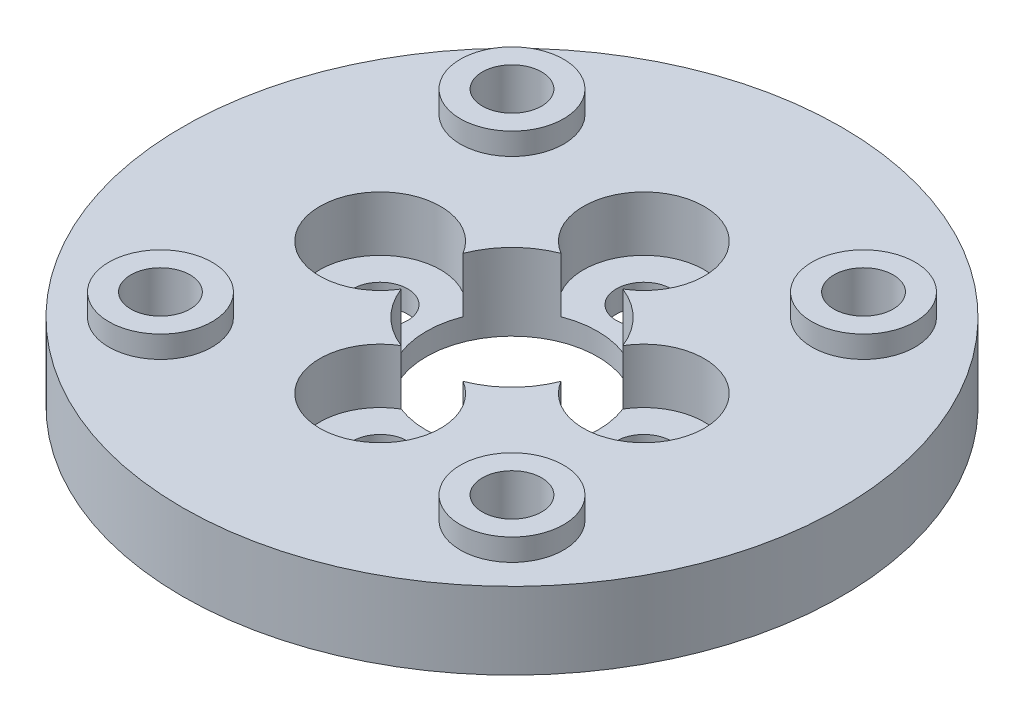
ISO-10303-21;
HEADER;
FILE_DESCRIPTION(('STEP AP214'),'2;1');
FILE_NAME('part.step','',(''),(''),'','','');
FILE_SCHEMA(('AUTOMOTIVE_DESIGN { 1 0 10303 214 1 1 1 1 }'));
ENDSEC;
DATA;
#1=APPLICATION_CONTEXT('core data for automotive mechanical design processes');
#2=APPLICATION_PROTOCOL_DEFINITION('international standard','automotive_design',2000,#1);
#3=PRODUCT_CONTEXT('',#1,'mechanical');
#4=PRODUCT('Part','Part','',(#3));
#5=PRODUCT_RELATED_PRODUCT_CATEGORY('part','',(#4));
#6=PRODUCT_DEFINITION_FORMATION('','',#4);
#7=PRODUCT_DEFINITION_CONTEXT('part definition',#1,'design');
#8=PRODUCT_DEFINITION('design','',#6,#7);
#9=PRODUCT_DEFINITION_SHAPE('','',#8);
#10=(LENGTH_UNIT() NAMED_UNIT(*) SI_UNIT(.MILLI.,.METRE.));
#11=(NAMED_UNIT(*) PLANE_ANGLE_UNIT() SI_UNIT($,.RADIAN.));
#12=(NAMED_UNIT(*) SI_UNIT($,.STERADIAN.) SOLID_ANGLE_UNIT());
#13=UNCERTAINTY_MEASURE_WITH_UNIT(LENGTH_MEASURE(1.E-05),#10,'distance_accuracy_value','');
#14=(GEOMETRIC_REPRESENTATION_CONTEXT(3) GLOBAL_UNCERTAINTY_ASSIGNED_CONTEXT((#13)) GLOBAL_UNIT_ASSIGNED_CONTEXT((#10,
#11,#12)) REPRESENTATION_CONTEXT('',''));
#15=CARTESIAN_POINT('',(0.,0.,0.));
#16=DIRECTION('',(0.,0.,1.));
#17=DIRECTION('',(1.,0.,0.));
#18=AXIS2_PLACEMENT_3D('',#15,#16,#17);
#19=CARTESIAN_POINT('',(0.,3.5,0.));
#20=DIRECTION('',(0.,1.,0.));
#21=DIRECTION('',(0.,0.,1.));
#22=AXIS2_PLACEMENT_3D('',#19,#20,#21);
#23=PLANE('',#22);
#24=CARTESIAN_POINT('',(-8.,3.5,8.));
#25=DIRECTION('',(0.,1.,0.));
#26=DIRECTION('',(0.,0.,1.));
#27=AXIS2_PLACEMENT_3D('',#24,#25,#26);
#28=CIRCLE('',#27,2.35);
#29=CARTESIAN_POINT('',(-8.,3.5,10.35));
#30=VERTEX_POINT('',#29);
#31=EDGE_CURVE('E337',#30,#30,#28,.T.);
#32=ORIENTED_EDGE('',*,*,#31,.F.);
#33=EDGE_LOOP('',(#32));
#34=FACE_BOUND('',#33,.T.);
#35=CARTESIAN_POINT('',(8.,3.5,8.));
#36=DIRECTION('',(0.,1.,0.));
#37=DIRECTION('',(0.,0.,1.));
#38=AXIS2_PLACEMENT_3D('',#35,#36,#37);
#39=CIRCLE('',#38,2.35);
#40=CARTESIAN_POINT('',(8.,3.5,10.35));
#41=VERTEX_POINT('',#40);
#42=EDGE_CURVE('E319',#41,#41,#39,.T.);
#43=ORIENTED_EDGE('',*,*,#42,.F.);
#44=EDGE_LOOP('',(#43));
#45=FACE_BOUND('',#44,.T.);
#46=CARTESIAN_POINT('',(-6.,3.5,0.));
#47=DIRECTION('',(0.,1.,0.));
#48=DIRECTION('',(0.,0.,1.));
#49=AXIS2_PLACEMENT_3D('',#46,#47,#48);
#50=CIRCLE('',#49,2.75);
#51=CARTESIAN_POINT('',(-3.63729166666667,3.5,-1.40716357670216));
#52=VERTEX_POINT('',#51);
#53=CARTESIAN_POINT('',(-3.63729166666667,3.5,1.40716357670216));
#54=VERTEX_POINT('',#53);
#55=EDGE_CURVE('E97',#52,#54,#50,.T.);
#56=ORIENTED_EDGE('',*,*,#55,.F.);
#57=CARTESIAN_POINT('',(0.,3.5,0.));
#58=DIRECTION('',(0.,1.,0.));
#59=DIRECTION('',(0.,0.,1.));
#60=AXIS2_PLACEMENT_3D('',#57,#58,#59);
#61=CIRCLE('',#60,3.9);
#62=CARTESIAN_POINT('',(-1.40716357670216,3.5,-3.63729166666667));
#63=VERTEX_POINT('',#62);
#64=EDGE_CURVE('E117',#63,#52,#61,.T.);
#65=ORIENTED_EDGE('',*,*,#64,.F.);
#66=CARTESIAN_POINT('',(0.,3.5,-6.));
#67=DIRECTION('',(0.,1.,0.));
#68=DIRECTION('',(0.,0.,1.));
#69=AXIS2_PLACEMENT_3D('',#66,#67,#68);
#70=CIRCLE('',#69,2.75);
#71=CARTESIAN_POINT('',(1.40716357670216,3.5,-3.63729166666667));
#72=VERTEX_POINT('',#71);
#73=EDGE_CURVE('E144',#72,#63,#70,.T.);
#74=ORIENTED_EDGE('',*,*,#73,.F.);
#75=CARTESIAN_POINT('',(3.63729166666667,3.5,-1.40716357670216));
#76=VERTEX_POINT('',#75);
#77=EDGE_CURVE('E121',#76,#72,#61,.T.);
#78=ORIENTED_EDGE('',*,*,#77,.F.);
#79=CARTESIAN_POINT('',(6.,3.5,0.));
#80=DIRECTION('',(0.,1.,0.));
#81=DIRECTION('',(0.,0.,1.));
#82=AXIS2_PLACEMENT_3D('',#79,#80,#81);
#83=CIRCLE('',#82,2.75);
#84=CARTESIAN_POINT('',(3.63729166666667,3.5,1.40716357670216));
#85=VERTEX_POINT('',#84);
#86=EDGE_CURVE('E143',#85,#76,#83,.T.);
#87=ORIENTED_EDGE('',*,*,#86,.F.);
#88=CARTESIAN_POINT('',(1.40716357670216,3.5,3.63729166666667));
#89=VERTEX_POINT('',#88);
#90=EDGE_CURVE('E120',#89,#85,#61,.T.);
#91=ORIENTED_EDGE('',*,*,#90,.F.);
#92=CARTESIAN_POINT('',(0.,3.5,6.));
#93=DIRECTION('',(0.,1.,0.));
#94=DIRECTION('',(0.,0.,1.));
#95=AXIS2_PLACEMENT_3D('',#92,#93,#94);
#96=CIRCLE('',#95,2.75);
#97=CARTESIAN_POINT('',(-1.40716357670216,3.5,3.63729166666667));
#98=VERTEX_POINT('',#97);
#99=EDGE_CURVE('E116',#98,#89,#96,.T.);
#100=ORIENTED_EDGE('',*,*,#99,.F.);
#101=EDGE_CURVE('E110',#54,#98,#61,.T.);
#102=ORIENTED_EDGE('',*,*,#101,.F.);
#103=EDGE_LOOP('',(#56,#65,#74,#78,#87,#91,#100,#102));
#104=FACE_BOUND('',#103,.T.);
#105=CARTESIAN_POINT('',(0.,3.5,0.));
#106=DIRECTION('',(0.,1.,0.));
#107=DIRECTION('',(0.,0.,1.));
#108=AXIS2_PLACEMENT_3D('',#105,#106,#107);
#109=CIRCLE('',#108,15.);
#110=CARTESIAN_POINT('',(0.,3.5,-15.));
#111=VERTEX_POINT('',#110);
#112=EDGE_CURVE('E192',#111,#111,#109,.T.);
#113=ORIENTED_EDGE('',*,*,#112,.T.);
#114=EDGE_LOOP('',(#113));
#115=FACE_BOUND('',#114,.T.);
#116=CARTESIAN_POINT('',(8.,3.5,-8.));
#117=DIRECTION('',(0.,1.,0.));
#118=DIRECTION('',(0.,0.,1.));
#119=AXIS2_PLACEMENT_3D('',#116,#117,#118);
#120=CIRCLE('',#119,2.35);
#121=CARTESIAN_POINT('',(8.,3.5,-5.65));
#122=VERTEX_POINT('',#121);
#123=EDGE_CURVE('E328',#122,#122,#120,.T.);
#124=ORIENTED_EDGE('',*,*,#123,.F.);
#125=EDGE_LOOP('',(#124));
#126=FACE_BOUND('',#125,.T.);
#127=CARTESIAN_POINT('',(-8.,3.5,-8.));
#128=DIRECTION('',(0.,1.,0.));
#129=DIRECTION('',(0.,0.,1.));
#130=AXIS2_PLACEMENT_3D('',#127,#128,#129);
#131=CIRCLE('',#130,2.35);
#132=CARTESIAN_POINT('',(-8.,3.5,-5.65));
#133=VERTEX_POINT('',#132);
#134=EDGE_CURVE('E346',#133,#133,#131,.T.);
#135=ORIENTED_EDGE('',*,*,#134,.F.);
#136=EDGE_LOOP('',(#135));
#137=FACE_BOUND('',#136,.T.);
#138=ADVANCED_FACE('F33',(#34,#45,#104,#115,#126,#137),#23,.T.);
#139=CARTESIAN_POINT('',(0.,3.5,0.));
#140=DIRECTION('',(0.,-1.,0.));
#141=DIRECTION('',(0.,0.,-1.));
#142=AXIS2_PLACEMENT_3D('',#139,#140,#141);
#143=CYLINDRICAL_SURFACE('',#142,15.);
#144=CARTESIAN_POINT('',(0.,0.,0.));
#145=DIRECTION('',(0.,1.,0.));
#146=DIRECTION('',(0.,0.,1.));
#147=AXIS2_PLACEMENT_3D('',#144,#145,#146);
#148=CIRCLE('',#147,15.);
#149=CARTESIAN_POINT('',(0.,0.,-15.));
#150=VERTEX_POINT('',#149);
#151=EDGE_CURVE('E132',#150,#150,#148,.T.);
#152=CARTESIAN_POINT('',(0.,3.5,-15.));
#153=CARTESIAN_POINT('',(0.,3.46354166666667,-15.));
#154=CARTESIAN_POINT('',(0.,3.42708333333333,-15.));
#155=CARTESIAN_POINT('',(0.,3.35416666666667,-15.));
#156=CARTESIAN_POINT('',(0.,3.31770833333333,-15.));
#157=CARTESIAN_POINT('',(0.,3.24479166666667,-15.));
#158=CARTESIAN_POINT('',(0.,3.20833333333333,-15.));
#159=CARTESIAN_POINT('',(0.,3.13541666666667,-15.));
#160=CARTESIAN_POINT('',(0.,3.09895833333333,-15.));
#161=CARTESIAN_POINT('',(0.,3.02604166666667,-15.));
#162=CARTESIAN_POINT('',(0.,2.98958333333333,-15.));
#163=CARTESIAN_POINT('',(0.,2.91666666666667,-15.));
#164=CARTESIAN_POINT('',(0.,2.88020833333333,-15.));
#165=CARTESIAN_POINT('',(0.,2.80729166666667,-15.));
#166=CARTESIAN_POINT('',(0.,2.77083333333333,-15.));
#167=CARTESIAN_POINT('',(0.,2.69791666666667,-15.));
#168=CARTESIAN_POINT('',(0.,2.66145833333333,-15.));
#169=CARTESIAN_POINT('',(0.,2.58854166666667,-15.));
#170=CARTESIAN_POINT('',(0.,2.55208333333333,-15.));
#171=CARTESIAN_POINT('',(0.,2.47916666666667,-15.));
#172=CARTESIAN_POINT('',(0.,2.44270833333333,-15.));
#173=CARTESIAN_POINT('',(0.,2.36979166666667,-15.));
#174=CARTESIAN_POINT('',(0.,2.33333333333333,-15.));
#175=CARTESIAN_POINT('',(0.,2.26041666666667,-15.));
#176=CARTESIAN_POINT('',(0.,2.22395833333333,-15.));
#177=CARTESIAN_POINT('',(0.,2.15104166666667,-15.));
#178=CARTESIAN_POINT('',(0.,2.11458333333333,-15.));
#179=CARTESIAN_POINT('',(0.,2.04166666666667,-15.));
#180=CARTESIAN_POINT('',(0.,2.00520833333333,-15.));
#181=CARTESIAN_POINT('',(0.,1.93229166666667,-15.));
#182=CARTESIAN_POINT('',(0.,1.89583333333333,-15.));
#183=CARTESIAN_POINT('',(0.,1.82291666666667,-15.));
#184=CARTESIAN_POINT('',(0.,1.78645833333333,-15.));
#185=CARTESIAN_POINT('',(0.,1.71354166666667,-15.));
#186=CARTESIAN_POINT('',(0.,1.67708333333333,-15.));
#187=CARTESIAN_POINT('',(0.,1.60416666666667,-15.));
#188=CARTESIAN_POINT('',(0.,1.56770833333333,-15.));
#189=CARTESIAN_POINT('',(0.,1.49479166666667,-15.));
#190=CARTESIAN_POINT('',(0.,1.45833333333333,-15.));
#191=CARTESIAN_POINT('',(0.,1.38541666666667,-15.));
#192=CARTESIAN_POINT('',(0.,1.34895833333333,-15.));
#193=CARTESIAN_POINT('',(0.,1.27604166666667,-15.));
#194=CARTESIAN_POINT('',(0.,1.23958333333333,-15.));
#195=CARTESIAN_POINT('',(0.,1.16666666666667,-15.));
#196=CARTESIAN_POINT('',(0.,1.13020833333333,-15.));
#197=CARTESIAN_POINT('',(0.,1.05729166666667,-15.));
#198=CARTESIAN_POINT('',(0.,1.02083333333333,-15.));
#199=CARTESIAN_POINT('',(0.,0.947916666666666,-15.));
#200=CARTESIAN_POINT('',(0.,0.911458333333333,-15.));
#201=CARTESIAN_POINT('',(0.,0.838541666666666,-15.));
#202=CARTESIAN_POINT('',(0.,0.802083333333333,-15.));
#203=CARTESIAN_POINT('',(0.,0.729166666666667,-15.));
#204=CARTESIAN_POINT('',(0.,0.692708333333333,-15.));
#205=CARTESIAN_POINT('',(0.,0.619791666666666,-15.));
#206=CARTESIAN_POINT('',(0.,0.583333333333333,-15.));
#207=CARTESIAN_POINT('',(0.,0.510416666666666,-15.));
#208=CARTESIAN_POINT('',(0.,0.473958333333333,-15.));
#209=CARTESIAN_POINT('',(0.,0.401041666666666,-15.));
#210=CARTESIAN_POINT('',(0.,0.364583333333333,-15.));
#211=CARTESIAN_POINT('',(0.,0.291666666666666,-15.));
#212=CARTESIAN_POINT('',(0.,0.255208333333333,-15.));
#213=CARTESIAN_POINT('',(0.,0.182291666666666,-15.));
#214=CARTESIAN_POINT('',(0.,0.145833333333333,-15.));
#215=CARTESIAN_POINT('',(0.,0.0729166666666663,-15.));
#216=CARTESIAN_POINT('',(0.,0.0364583333333329,-15.));
#217=CARTESIAN_POINT('',(0.,0.,-15.));
#218=B_SPLINE_CURVE_WITH_KNOTS('',3,(#152,#153,#154,#155,#156,#157,#158,#159,#160,#161,#162,
#163,#164,#165,#166,#167,#168,#169,#170,#171,#172,#173,#174,#175,#176,#177,#178,#179,#180,#181,
#182,#183,#184,#185,#186,#187,#188,#189,#190,#191,#192,#193,#194,#195,#196,#197,#198,#199,#200,
#201,#202,#203,#204,#205,#206,#207,#208,#209,#210,#211,#212,#213,#214,#215,#216,#217),
.UNSPECIFIED.,.F.,.F.,(4,2,2,2,2,2,2,2,2,2,2,2,2,2,2,2,2,2,2,2,2,2,2,2,2,2,2,2,2,2,2,2,4),(0.,
0.109375,0.21875,0.328125,0.4375,0.546875,0.65625,0.765625,0.875,0.984375,1.09375,1.203125,
1.3125,1.421875,1.53125,1.640625,1.75,1.859375,1.96875,2.078125,2.1875,2.296875,2.40625,
2.515625,2.625,2.734375,2.84375,2.953125,3.0625,3.171875,3.28125,3.390625,3.5),.UNSPECIFIED.);
#219=EDGE_CURVE('BSEAM35',#111,#150,#218,.T.);
#220=ORIENTED_EDGE('',*,*,#112,.F.);
#221=ORIENTED_EDGE('',*,*,#151,.T.);
#222=ORIENTED_EDGE('',*,*,#219,.T.);
#223=ORIENTED_EDGE('',*,*,#219,.F.);
#224=EDGE_LOOP('',(#220,#222,#221,#223));
#225=FACE_BOUND('',#224,.T.);
#226=ADVANCED_FACE('F35',(#225),#143,.T.);
#227=CARTESIAN_POINT('',(0.,0.,0.));
#228=DIRECTION('',(0.,1.,0.));
#229=DIRECTION('',(0.,0.,1.));
#230=AXIS2_PLACEMENT_3D('',#227,#228,#229);
#231=PLANE('',#230);
#232=CARTESIAN_POINT('',(-8.,0.,-8.));
#233=DIRECTION('',(0.,1.,0.));
#234=DIRECTION('',(0.,0.,1.));
#235=AXIS2_PLACEMENT_3D('',#232,#233,#234);
#236=CIRCLE('',#235,1.35);
#237=CARTESIAN_POINT('',(-8.,0.,-6.65));
#238=VERTEX_POINT('',#237);
#239=EDGE_CURVE('E246',#238,#238,#236,.T.);
#240=ORIENTED_EDGE('',*,*,#239,.T.);
#241=EDGE_LOOP('',(#240));
#242=FACE_BOUND('',#241,.T.);
#243=CARTESIAN_POINT('',(8.,0.,-8.));
#244=DIRECTION('',(0.,1.,0.));
#245=DIRECTION('',(0.,0.,1.));
#246=AXIS2_PLACEMENT_3D('',#243,#244,#245);
#247=CIRCLE('',#246,1.35);
#248=CARTESIAN_POINT('',(8.,0.,-6.65));
#249=VERTEX_POINT('',#248);
#250=EDGE_CURVE('E250',#249,#249,#247,.T.);
#251=ORIENTED_EDGE('',*,*,#250,.T.);
#252=EDGE_LOOP('',(#251));
#253=FACE_BOUND('',#252,.T.);
#254=CARTESIAN_POINT('',(8.,0.,8.));
#255=DIRECTION('',(0.,1.,0.));
#256=DIRECTION('',(0.,0.,1.));
#257=AXIS2_PLACEMENT_3D('',#254,#255,#256);
#258=CIRCLE('',#257,1.35);
#259=CARTESIAN_POINT('',(8.,0.,9.35));
#260=VERTEX_POINT('',#259);
#261=EDGE_CURVE('E254',#260,#260,#258,.T.);
#262=ORIENTED_EDGE('',*,*,#261,.T.);
#263=EDGE_LOOP('',(#262));
#264=FACE_BOUND('',#263,.T.);
#265=CARTESIAN_POINT('',(-8.,0.,8.));
#266=DIRECTION('',(0.,1.,0.));
#267=DIRECTION('',(0.,0.,1.));
#268=AXIS2_PLACEMENT_3D('',#265,#266,#267);
#269=CIRCLE('',#268,1.35);
#270=CARTESIAN_POINT('',(-8.,0.,9.35));
#271=VERTEX_POINT('',#270);
#272=EDGE_CURVE('E105',#271,#271,#269,.T.);
#273=ORIENTED_EDGE('',*,*,#272,.T.);
#274=EDGE_LOOP('',(#273));
#275=FACE_BOUND('',#274,.T.);
#276=CARTESIAN_POINT('',(-6.,0.,0.));
#277=DIRECTION('',(0.,1.,0.));
#278=DIRECTION('',(0.,0.,1.));
#279=AXIS2_PLACEMENT_3D('',#276,#277,#278);
#280=CIRCLE('',#279,1.25);
#281=CARTESIAN_POINT('',(-6.,0.,1.25));
#282=VERTEX_POINT('',#281);
#283=EDGE_CURVE('E146',#282,#282,#280,.T.);
#284=ORIENTED_EDGE('',*,*,#283,.T.);
#285=EDGE_LOOP('',(#284));
#286=FACE_BOUND('',#285,.T.);
#287=CARTESIAN_POINT('',(0.,0.,-6.));
#288=DIRECTION('',(0.,1.,0.));
#289=DIRECTION('',(0.,0.,1.));
#290=AXIS2_PLACEMENT_3D('',#287,#288,#289);
#291=CIRCLE('',#290,1.25);
#292=CARTESIAN_POINT('',(0.,0.,-4.75));
#293=VERTEX_POINT('',#292);
#294=EDGE_CURVE('E157',#293,#293,#291,.T.);
#295=ORIENTED_EDGE('',*,*,#294,.T.);
#296=EDGE_LOOP('',(#295));
#297=FACE_BOUND('',#296,.T.);
#298=CARTESIAN_POINT('',(6.,0.,0.));
#299=DIRECTION('',(0.,1.,0.));
#300=DIRECTION('',(0.,0.,1.));
#301=AXIS2_PLACEMENT_3D('',#298,#299,#300);
#302=CIRCLE('',#301,1.25);
#303=CARTESIAN_POINT('',(6.,0.,1.25));
#304=VERTEX_POINT('',#303);
#305=EDGE_CURVE('E167',#304,#304,#302,.T.);
#306=ORIENTED_EDGE('',*,*,#305,.T.);
#307=EDGE_LOOP('',(#306));
#308=FACE_BOUND('',#307,.T.);
#309=CARTESIAN_POINT('',(0.,0.,6.));
#310=DIRECTION('',(0.,1.,0.));
#311=DIRECTION('',(0.,0.,1.));
#312=AXIS2_PLACEMENT_3D('',#309,#310,#311);
#313=CIRCLE('',#312,1.25);
#314=CARTESIAN_POINT('',(0.,0.,7.25));
#315=VERTEX_POINT('',#314);
#316=EDGE_CURVE('E118',#315,#315,#313,.T.);
#317=ORIENTED_EDGE('',*,*,#316,.T.);
#318=EDGE_LOOP('',(#317));
#319=FACE_BOUND('',#318,.T.);
#320=CARTESIAN_POINT('',(0.,0.,0.));
#321=DIRECTION('',(0.,1.,0.));
#322=DIRECTION('',(0.,0.,1.));
#323=AXIS2_PLACEMENT_3D('',#320,#321,#322);
#324=CIRCLE('',#323,3.9);
#325=CARTESIAN_POINT('',(0.,0.,3.9));
#326=VERTEX_POINT('',#325);
#327=EDGE_CURVE('E128',#326,#326,#324,.T.);
#328=ORIENTED_EDGE('',*,*,#327,.T.);
#329=EDGE_LOOP('',(#328));
#330=FACE_BOUND('',#329,.T.);
#331=ORIENTED_EDGE('',*,*,#151,.F.);
#332=EDGE_LOOP('',(#331));
#333=FACE_BOUND('',#332,.T.);
#334=ADVANCED_FACE('F231',(#242,#253,#264,#275,#286,#297,#308,#319,#330,#333),#231,.F.);
#335=CARTESIAN_POINT('',(0.,0.,0.));
#336=DIRECTION('',(0.,1.,0.));
#337=DIRECTION('',(0.,0.,1.));
#338=AXIS2_PLACEMENT_3D('',#335,#336,#337);
#339=CYLINDRICAL_SURFACE('',#338,3.9);
#340=ORIENTED_EDGE('',*,*,#327,.F.);
#341=EDGE_LOOP('',(#340));
#342=FACE_BOUND('',#341,.T.);
#343=CARTESIAN_POINT('',(0.,1.,0.));
#344=DIRECTION('',(0.,-1.,0.));
#345=DIRECTION('',(0.,0.,-1.));
#346=AXIS2_PLACEMENT_3D('',#343,#344,#345);
#347=CIRCLE('',#346,3.9);
#348=CARTESIAN_POINT('',(-3.63729166666667,1.,-1.40716357670216));
#349=VERTEX_POINT('',#348);
#350=CARTESIAN_POINT('',(-3.63729166666667,1.,1.40716357670216));
#351=VERTEX_POINT('',#350);
#352=EDGE_CURVE('E112',#349,#351,#347,.F.);
#353=ORIENTED_EDGE('',*,*,#352,.T.);
#354=DIRECTION('',(0.,1.,0.));
#355=VECTOR('',#354,1.);
#356=CARTESIAN_POINT('',(-3.63729166666667,2.25,1.40716357670216));
#357=LINE('',#356,#355);
#358=EDGE_CURVE('E11',#351,#54,#357,.T.);
#359=ORIENTED_EDGE('',*,*,#358,.T.);
#360=ORIENTED_EDGE('',*,*,#101,.T.);
#361=DIRECTION('',(0.,1.,0.));
#362=VECTOR('',#361,1.);
#363=CARTESIAN_POINT('',(-1.40716357670216,2.25,3.63729166666667));
#364=LINE('',#363,#362);
#365=CARTESIAN_POINT('',(-1.40716357670216,1.,3.63729166666667));
#366=VERTEX_POINT('',#365);
#367=EDGE_CURVE('E190',#98,#366,#364,.F.);
#368=ORIENTED_EDGE('',*,*,#367,.T.);
#369=CARTESIAN_POINT('',(0.,1.,0.));
#370=DIRECTION('',(0.,-1.,0.));
#371=DIRECTION('',(0.,0.,-1.));
#372=AXIS2_PLACEMENT_3D('',#369,#370,#371);
#373=CIRCLE('',#372,3.9);
#374=CARTESIAN_POINT('',(1.40716357670216,1.,3.63729166666667));
#375=VERTEX_POINT('',#374);
#376=EDGE_CURVE('E186',#366,#375,#373,.F.);
#377=ORIENTED_EDGE('',*,*,#376,.T.);
#378=DIRECTION('',(0.,1.,0.));
#379=VECTOR('',#378,1.);
#380=CARTESIAN_POINT('',(1.40716357670216,2.25,3.63729166666667));
#381=LINE('',#380,#379);
#382=EDGE_CURVE('E188',#375,#89,#381,.T.);
#383=ORIENTED_EDGE('',*,*,#382,.T.);
#384=ORIENTED_EDGE('',*,*,#90,.T.);
#385=DIRECTION('',(0.,1.,0.));
#386=VECTOR('',#385,1.);
#387=CARTESIAN_POINT('',(3.63729166666667,2.25,1.40716357670216));
#388=LINE('',#387,#386);
#389=CARTESIAN_POINT('',(3.63729166666667,1.,1.40716357670216));
#390=VERTEX_POINT('',#389);
#391=EDGE_CURVE('E189',#85,#390,#388,.F.);
#392=ORIENTED_EDGE('',*,*,#391,.T.);
#393=CARTESIAN_POINT('',(0.,1.,0.));
#394=DIRECTION('',(0.,-1.,0.));
#395=DIRECTION('',(0.,0.,-1.));
#396=AXIS2_PLACEMENT_3D('',#393,#394,#395);
#397=CIRCLE('',#396,3.9);
#398=CARTESIAN_POINT('',(3.63729166666667,1.,-1.40716357670216));
#399=VERTEX_POINT('',#398);
#400=EDGE_CURVE('E199',#390,#399,#397,.F.);
#401=ORIENTED_EDGE('',*,*,#400,.T.);
#402=DIRECTION('',(0.,1.,0.));
#403=VECTOR('',#402,1.);
#404=CARTESIAN_POINT('',(3.63729166666667,2.25,-1.40716357670216));
#405=LINE('',#404,#403);
#406=EDGE_CURVE('E140',#399,#76,#405,.T.);
#407=ORIENTED_EDGE('',*,*,#406,.T.);
#408=ORIENTED_EDGE('',*,*,#77,.T.);
#409=DIRECTION('',(0.,1.,0.));
#410=VECTOR('',#409,1.);
#411=CARTESIAN_POINT('',(1.40716357670216,2.25,-3.63729166666667));
#412=LINE('',#411,#410);
#413=CARTESIAN_POINT('',(1.40716357670216,1.,-3.63729166666667));
#414=VERTEX_POINT('',#413);
#415=EDGE_CURVE('E138',#72,#414,#412,.F.);
#416=ORIENTED_EDGE('',*,*,#415,.T.);
#417=CARTESIAN_POINT('',(0.,1.,0.));
#418=DIRECTION('',(0.,-1.,0.));
#419=DIRECTION('',(0.,0.,-1.));
#420=AXIS2_PLACEMENT_3D('',#417,#418,#419);
#421=CIRCLE('',#420,3.9);
#422=CARTESIAN_POINT('',(-1.40716357670216,1.,-3.63729166666667));
#423=VERTEX_POINT('',#422);
#424=EDGE_CURVE('E203',#414,#423,#421,.F.);
#425=ORIENTED_EDGE('',*,*,#424,.T.);
#426=DIRECTION('',(0.,1.,0.));
#427=VECTOR('',#426,1.);
#428=CARTESIAN_POINT('',(-1.40716357670216,2.25,-3.63729166666667));
#429=LINE('',#428,#427);
#430=EDGE_CURVE('E205',#423,#63,#429,.T.);
#431=ORIENTED_EDGE('',*,*,#430,.T.);
#432=ORIENTED_EDGE('',*,*,#64,.T.);
#433=DIRECTION('',(0.,1.,0.));
#434=VECTOR('',#433,1.);
#435=CARTESIAN_POINT('',(-3.63729166666667,2.25,-1.40716357670216));
#436=LINE('',#435,#434);
#437=EDGE_CURVE('E41',#52,#349,#436,.F.);
#438=ORIENTED_EDGE('',*,*,#437,.T.);
#439=EDGE_LOOP('',(#353,#359,#360,#368,#377,#383,#384,#392,#401,#407,#408,#416,#425,#431,#432,#438));
#440=FACE_BOUND('',#439,.T.);
#441=ADVANCED_FACE('F108',(#342,#440),#339,.F.);
#442=CARTESIAN_POINT('',(0.,3.5,6.));
#443=DIRECTION('',(0.,1.,0.));
#444=DIRECTION('',(0.,0.,1.));
#445=AXIS2_PLACEMENT_3D('',#442,#443,#444);
#446=CYLINDRICAL_SURFACE('',#445,2.75);
#447=CARTESIAN_POINT('',(0.,1.,6.));
#448=DIRECTION('',(0.,1.,0.));
#449=DIRECTION('',(0.,0.,1.));
#450=AXIS2_PLACEMENT_3D('',#447,#448,#449);
#451=CIRCLE('',#450,2.75);
#452=EDGE_CURVE('E171',#366,#375,#451,.T.);
#453=ORIENTED_EDGE('',*,*,#452,.F.);
#454=ORIENTED_EDGE('',*,*,#367,.F.);
#455=ORIENTED_EDGE('',*,*,#99,.T.);
#456=ORIENTED_EDGE('',*,*,#382,.F.);
#457=EDGE_LOOP('',(#453,#454,#455,#456));
#458=FACE_BOUND('',#457,.T.);
#459=ADVANCED_FACE('F181',(#458),#446,.F.);
#460=CARTESIAN_POINT('',(1.25,1.,6.));
#461=DIRECTION('',(0.,-1.,0.));
#462=DIRECTION('',(0.,0.,-1.));
#463=AXIS2_PLACEMENT_3D('',#460,#461,#462);
#464=PLANE('',#463);
#465=CARTESIAN_POINT('',(0.,1.,6.));
#466=DIRECTION('',(0.,1.,0.));
#467=DIRECTION('',(0.,0.,1.));
#468=AXIS2_PLACEMENT_3D('',#465,#466,#467);
#469=CIRCLE('',#468,1.25);
#470=CARTESIAN_POINT('',(0.,1.,7.25));
#471=VERTEX_POINT('',#470);
#472=EDGE_CURVE('E123',#471,#471,#469,.T.);
#473=ORIENTED_EDGE('',*,*,#472,.F.);
#474=EDGE_LOOP('',(#473));
#475=FACE_BOUND('',#474,.T.);
#476=ORIENTED_EDGE('',*,*,#452,.T.);
#477=ORIENTED_EDGE('',*,*,#376,.F.);
#478=EDGE_LOOP('',(#476,#477));
#479=FACE_BOUND('',#478,.T.);
#480=ADVANCED_FACE('F178',(#475,#479),#464,.F.);
#481=CARTESIAN_POINT('',(0.,3.5,6.));
#482=DIRECTION('',(0.,1.,0.));
#483=DIRECTION('',(0.,0.,1.));
#484=AXIS2_PLACEMENT_3D('',#481,#482,#483);
#485=CYLINDRICAL_SURFACE('',#484,1.25);
#486=ORIENTED_EDGE('',*,*,#316,.F.);
#487=EDGE_LOOP('',(#486));
#488=FACE_BOUND('',#487,.T.);
#489=ORIENTED_EDGE('',*,*,#472,.T.);
#490=EDGE_LOOP('',(#489));
#491=FACE_BOUND('',#490,.T.);
#492=ADVANCED_FACE('F176',(#488,#491),#485,.F.);
#493=CARTESIAN_POINT('',(7.25,1.,0.));
#494=DIRECTION('',(0.,-1.,0.));
#495=DIRECTION('',(0.,0.,-1.));
#496=AXIS2_PLACEMENT_3D('',#493,#494,#495);
#497=PLANE('',#496);
#498=CARTESIAN_POINT('',(6.,1.,0.));
#499=DIRECTION('',(0.,1.,0.));
#500=DIRECTION('',(0.,0.,1.));
#501=AXIS2_PLACEMENT_3D('',#498,#499,#500);
#502=CIRCLE('',#501,1.25);
#503=CARTESIAN_POINT('',(6.,1.,1.25));
#504=VERTEX_POINT('',#503);
#505=EDGE_CURVE('E164',#504,#504,#502,.T.);
#506=ORIENTED_EDGE('',*,*,#505,.F.);
#507=EDGE_LOOP('',(#506));
#508=FACE_BOUND('',#507,.T.);
#509=CARTESIAN_POINT('',(6.,1.,0.));
#510=DIRECTION('',(0.,1.,0.));
#511=DIRECTION('',(0.,0.,1.));
#512=AXIS2_PLACEMENT_3D('',#509,#510,#511);
#513=CIRCLE('',#512,2.75);
#514=EDGE_CURVE('E161',#390,#399,#513,.T.);
#515=ORIENTED_EDGE('',*,*,#514,.T.);
#516=ORIENTED_EDGE('',*,*,#400,.F.);
#517=EDGE_LOOP('',(#515,#516));
#518=FACE_BOUND('',#517,.T.);
#519=ADVANCED_FACE('F273',(#508,#518),#497,.F.);
#520=CARTESIAN_POINT('',(6.,3.5,0.));
#521=DIRECTION('',(0.,1.,0.));
#522=DIRECTION('',(0.,0.,1.));
#523=AXIS2_PLACEMENT_3D('',#520,#521,#522);
#524=CYLINDRICAL_SURFACE('',#523,2.75);
#525=ORIENTED_EDGE('',*,*,#514,.F.);
#526=ORIENTED_EDGE('',*,*,#391,.F.);
#527=ORIENTED_EDGE('',*,*,#86,.T.);
#528=ORIENTED_EDGE('',*,*,#406,.F.);
#529=EDGE_LOOP('',(#525,#526,#527,#528));
#530=FACE_BOUND('',#529,.T.);
#531=ADVANCED_FACE('F220',(#530),#524,.F.);
#532=CARTESIAN_POINT('',(6.,3.5,0.));
#533=DIRECTION('',(0.,1.,0.));
#534=DIRECTION('',(0.,0.,1.));
#535=AXIS2_PLACEMENT_3D('',#532,#533,#534);
#536=CYLINDRICAL_SURFACE('',#535,1.25);
#537=ORIENTED_EDGE('',*,*,#305,.F.);
#538=EDGE_LOOP('',(#537));
#539=FACE_BOUND('',#538,.T.);
#540=ORIENTED_EDGE('',*,*,#505,.T.);
#541=EDGE_LOOP('',(#540));
#542=FACE_BOUND('',#541,.T.);
#543=ADVANCED_FACE('F211',(#539,#542),#536,.F.);
#544=CARTESIAN_POINT('',(1.25,1.,-6.));
#545=DIRECTION('',(0.,-1.,0.));
#546=DIRECTION('',(0.,0.,-1.));
#547=AXIS2_PLACEMENT_3D('',#544,#545,#546);
#548=PLANE('',#547);
#549=CARTESIAN_POINT('',(0.,1.,-6.));
#550=DIRECTION('',(0.,1.,0.));
#551=DIRECTION('',(0.,0.,1.));
#552=AXIS2_PLACEMENT_3D('',#549,#550,#551);
#553=CIRCLE('',#552,1.25);
#554=CARTESIAN_POINT('',(0.,1.,-4.75));
#555=VERTEX_POINT('',#554);
#556=EDGE_CURVE('E148',#555,#555,#553,.T.);
#557=ORIENTED_EDGE('',*,*,#556,.F.);
#558=EDGE_LOOP('',(#557));
#559=FACE_BOUND('',#558,.T.);
#560=CARTESIAN_POINT('',(0.,1.,-6.));
#561=DIRECTION('',(0.,1.,0.));
#562=DIRECTION('',(0.,0.,1.));
#563=AXIS2_PLACEMENT_3D('',#560,#561,#562);
#564=CIRCLE('',#563,2.75);
#565=EDGE_CURVE('E55',#414,#423,#564,.T.);
#566=ORIENTED_EDGE('',*,*,#565,.T.);
#567=ORIENTED_EDGE('',*,*,#424,.F.);
#568=EDGE_LOOP('',(#566,#567));
#569=FACE_BOUND('',#568,.T.);
#570=ADVANCED_FACE('F209',(#559,#569),#548,.F.);
#571=CARTESIAN_POINT('',(0.,3.5,-6.));
#572=DIRECTION('',(0.,1.,0.));
#573=DIRECTION('',(0.,0.,1.));
#574=AXIS2_PLACEMENT_3D('',#571,#572,#573);
#575=CYLINDRICAL_SURFACE('',#574,2.75);
#576=ORIENTED_EDGE('',*,*,#565,.F.);
#577=ORIENTED_EDGE('',*,*,#415,.F.);
#578=ORIENTED_EDGE('',*,*,#73,.T.);
#579=ORIENTED_EDGE('',*,*,#430,.F.);
#580=EDGE_LOOP('',(#576,#577,#578,#579));
#581=FACE_BOUND('',#580,.T.);
#582=ADVANCED_FACE('F207',(#581),#575,.F.);
#583=CARTESIAN_POINT('',(0.,3.5,-6.));
#584=DIRECTION('',(0.,1.,0.));
#585=DIRECTION('',(0.,0.,1.));
#586=AXIS2_PLACEMENT_3D('',#583,#584,#585);
#587=CYLINDRICAL_SURFACE('',#586,1.25);
#588=ORIENTED_EDGE('',*,*,#294,.F.);
#589=EDGE_LOOP('',(#588));
#590=FACE_BOUND('',#589,.T.);
#591=ORIENTED_EDGE('',*,*,#556,.T.);
#592=EDGE_LOOP('',(#591));
#593=FACE_BOUND('',#592,.T.);
#594=ADVANCED_FACE('F218',(#590,#593),#587,.F.);
#595=CARTESIAN_POINT('',(-6.,3.5,0.));
#596=DIRECTION('',(0.,1.,0.));
#597=DIRECTION('',(0.,0.,1.));
#598=AXIS2_PLACEMENT_3D('',#595,#596,#597);
#599=CYLINDRICAL_SURFACE('',#598,2.75);
#600=CARTESIAN_POINT('',(-6.,1.,0.));
#601=DIRECTION('',(0.,1.,0.));
#602=DIRECTION('',(0.,0.,1.));
#603=AXIS2_PLACEMENT_3D('',#600,#601,#602);
#604=CIRCLE('',#603,2.75);
#605=EDGE_CURVE('E47',#349,#351,#604,.T.);
#606=ORIENTED_EDGE('',*,*,#605,.F.);
#607=ORIENTED_EDGE('',*,*,#437,.F.);
#608=ORIENTED_EDGE('',*,*,#55,.T.);
#609=ORIENTED_EDGE('',*,*,#358,.F.);
#610=EDGE_LOOP('',(#606,#607,#608,#609));
#611=FACE_BOUND('',#610,.T.);
#612=ADVANCED_FACE('F98',(#611),#599,.F.);
#613=CARTESIAN_POINT('',(-4.75,1.,0.));
#614=DIRECTION('',(0.,-1.,0.));
#615=DIRECTION('',(0.,0.,-1.));
#616=AXIS2_PLACEMENT_3D('',#613,#614,#615);
#617=PLANE('',#616);
#618=CARTESIAN_POINT('',(-6.,1.,0.));
#619=DIRECTION('',(0.,1.,0.));
#620=DIRECTION('',(0.,0.,1.));
#621=AXIS2_PLACEMENT_3D('',#618,#619,#620);
#622=CIRCLE('',#621,1.25);
#623=CARTESIAN_POINT('',(-6.,1.,1.25));
#624=VERTEX_POINT('',#623);
#625=EDGE_CURVE('E151',#624,#624,#622,.T.);
#626=ORIENTED_EDGE('',*,*,#625,.F.);
#627=EDGE_LOOP('',(#626));
#628=FACE_BOUND('',#627,.T.);
#629=ORIENTED_EDGE('',*,*,#605,.T.);
#630=ORIENTED_EDGE('',*,*,#352,.F.);
#631=EDGE_LOOP('',(#629,#630));
#632=FACE_BOUND('',#631,.T.);
#633=ADVANCED_FACE('F289',(#628,#632),#617,.F.);
#634=CARTESIAN_POINT('',(-6.,3.5,0.));
#635=DIRECTION('',(0.,1.,0.));
#636=DIRECTION('',(0.,0.,1.));
#637=AXIS2_PLACEMENT_3D('',#634,#635,#636);
#638=CYLINDRICAL_SURFACE('',#637,1.25);
#639=ORIENTED_EDGE('',*,*,#283,.F.);
#640=EDGE_LOOP('',(#639));
#641=FACE_BOUND('',#640,.T.);
#642=ORIENTED_EDGE('',*,*,#625,.T.);
#643=EDGE_LOOP('',(#642));
#644=FACE_BOUND('',#643,.T.);
#645=ADVANCED_FACE('F295',(#641,#644),#638,.F.);
#646=CARTESIAN_POINT('',(-8.,3.5,8.));
#647=DIRECTION('',(0.,1.,0.));
#648=DIRECTION('',(0.,0.,1.));
#649=AXIS2_PLACEMENT_3D('',#646,#647,#648);
#650=CYLINDRICAL_SURFACE('',#649,1.35);
#651=ORIENTED_EDGE('',*,*,#272,.F.);
#652=EDGE_LOOP('',(#651));
#653=FACE_BOUND('',#652,.T.);
#654=CARTESIAN_POINT('',(-8.,4.5,8.));
#655=DIRECTION('',(0.,1.,0.));
#656=DIRECTION('',(0.,0.,1.));
#657=AXIS2_PLACEMENT_3D('',#654,#655,#656);
#658=CIRCLE('',#657,1.35);
#659=CARTESIAN_POINT('',(-8.,4.5,9.35));
#660=VERTEX_POINT('',#659);
#661=EDGE_CURVE('E340',#660,#660,#658,.T.);
#662=ORIENTED_EDGE('',*,*,#661,.T.);
#663=EDGE_LOOP('',(#662));
#664=FACE_BOUND('',#663,.T.);
#665=ADVANCED_FACE('F299',(#653,#664),#650,.F.);
#666=CARTESIAN_POINT('',(8.,3.5,8.));
#667=DIRECTION('',(0.,1.,0.));
#668=DIRECTION('',(0.,0.,1.));
#669=AXIS2_PLACEMENT_3D('',#666,#667,#668);
#670=CYLINDRICAL_SURFACE('',#669,1.35);
#671=ORIENTED_EDGE('',*,*,#261,.F.);
#672=EDGE_LOOP('',(#671));
#673=FACE_BOUND('',#672,.T.);
#674=CARTESIAN_POINT('',(8.,4.5,8.));
#675=DIRECTION('',(0.,1.,0.));
#676=DIRECTION('',(0.,0.,1.));
#677=AXIS2_PLACEMENT_3D('',#674,#675,#676);
#678=CIRCLE('',#677,1.35);
#679=CARTESIAN_POINT('',(8.,4.5,9.35));
#680=VERTEX_POINT('',#679);
#681=EDGE_CURVE('E322',#680,#680,#678,.T.);
#682=ORIENTED_EDGE('',*,*,#681,.T.);
#683=EDGE_LOOP('',(#682));
#684=FACE_BOUND('',#683,.T.);
#685=ADVANCED_FACE('F307',(#673,#684),#670,.F.);
#686=CARTESIAN_POINT('',(8.,3.5,-8.));
#687=DIRECTION('',(0.,1.,0.));
#688=DIRECTION('',(0.,0.,1.));
#689=AXIS2_PLACEMENT_3D('',#686,#687,#688);
#690=CYLINDRICAL_SURFACE('',#689,1.35);
#691=ORIENTED_EDGE('',*,*,#250,.F.);
#692=EDGE_LOOP('',(#691));
#693=FACE_BOUND('',#692,.T.);
#694=CARTESIAN_POINT('',(8.,4.5,-8.));
#695=DIRECTION('',(0.,1.,0.));
#696=DIRECTION('',(0.,0.,1.));
#697=AXIS2_PLACEMENT_3D('',#694,#695,#696);
#698=CIRCLE('',#697,1.35);
#699=CARTESIAN_POINT('',(8.,4.5,-6.65));
#700=VERTEX_POINT('',#699);
#701=EDGE_CURVE('E331',#700,#700,#698,.T.);
#702=ORIENTED_EDGE('',*,*,#701,.T.);
#703=EDGE_LOOP('',(#702));
#704=FACE_BOUND('',#703,.T.);
#705=ADVANCED_FACE('F394',(#693,#704),#690,.F.);
#706=CARTESIAN_POINT('',(-8.,3.5,-8.));
#707=DIRECTION('',(0.,1.,0.));
#708=DIRECTION('',(0.,0.,1.));
#709=AXIS2_PLACEMENT_3D('',#706,#707,#708);
#710=CYLINDRICAL_SURFACE('',#709,1.35);
#711=ORIENTED_EDGE('',*,*,#239,.F.);
#712=EDGE_LOOP('',(#711));
#713=FACE_BOUND('',#712,.T.);
#714=CARTESIAN_POINT('',(-8.,4.5,-8.));
#715=DIRECTION('',(0.,1.,0.));
#716=DIRECTION('',(0.,0.,1.));
#717=AXIS2_PLACEMENT_3D('',#714,#715,#716);
#718=CIRCLE('',#717,1.35);
#719=CARTESIAN_POINT('',(-8.,4.5,-6.65));
#720=VERTEX_POINT('',#719);
#721=EDGE_CURVE('E349',#720,#720,#718,.T.);
#722=ORIENTED_EDGE('',*,*,#721,.T.);
#723=EDGE_LOOP('',(#722));
#724=FACE_BOUND('',#723,.T.);
#725=ADVANCED_FACE('F355',(#713,#724),#710,.F.);
#726=CARTESIAN_POINT('',(8.,4.5,8.));
#727=DIRECTION('',(0.,1.,0.));
#728=DIRECTION('',(0.,0.,1.));
#729=AXIS2_PLACEMENT_3D('',#726,#727,#728);
#730=PLANE('',#729);
#731=CARTESIAN_POINT('',(8.,4.5,8.));
#732=DIRECTION('',(0.,1.,0.));
#733=DIRECTION('',(0.,0.,1.));
#734=AXIS2_PLACEMENT_3D('',#731,#732,#733);
#735=CIRCLE('',#734,2.35);
#736=CARTESIAN_POINT('',(8.,4.5,10.35));
#737=VERTEX_POINT('',#736);
#738=EDGE_CURVE('E318',#737,#737,#735,.T.);
#739=ORIENTED_EDGE('',*,*,#738,.T.);
#740=EDGE_LOOP('',(#739));
#741=FACE_BOUND('',#740,.T.);
#742=ORIENTED_EDGE('',*,*,#681,.F.);
#743=EDGE_LOOP('',(#742));
#744=FACE_BOUND('',#743,.T.);
#745=ADVANCED_FACE('F385',(#741,#744),#730,.T.);
#746=CARTESIAN_POINT('',(8.,4.5,8.));
#747=DIRECTION('',(0.,-1.,0.));
#748=DIRECTION('',(0.,0.,-1.));
#749=AXIS2_PLACEMENT_3D('',#746,#747,#748);
#750=CYLINDRICAL_SURFACE('',#749,2.35);
#751=ORIENTED_EDGE('',*,*,#738,.F.);
#752=EDGE_LOOP('',(#751));
#753=FACE_BOUND('',#752,.T.);
#754=ORIENTED_EDGE('',*,*,#42,.T.);
#755=EDGE_LOOP('',(#754));
#756=FACE_BOUND('',#755,.T.);
#757=ADVANCED_FACE('F380',(#753,#756),#750,.T.);
#758=CARTESIAN_POINT('',(8.,4.5,-8.));
#759=DIRECTION('',(0.,1.,0.));
#760=DIRECTION('',(0.,0.,1.));
#761=AXIS2_PLACEMENT_3D('',#758,#759,#760);
#762=PLANE('',#761);
#763=CARTESIAN_POINT('',(8.,4.5,-8.));
#764=DIRECTION('',(0.,1.,0.));
#765=DIRECTION('',(0.,0.,1.));
#766=AXIS2_PLACEMENT_3D('',#763,#764,#765);
#767=CIRCLE('',#766,2.35);
#768=CARTESIAN_POINT('',(8.,4.5,-5.65));
#769=VERTEX_POINT('',#768);
#770=EDGE_CURVE('E327',#769,#769,#767,.T.);
#771=ORIENTED_EDGE('',*,*,#770,.T.);
#772=EDGE_LOOP('',(#771));
#773=FACE_BOUND('',#772,.T.);
#774=ORIENTED_EDGE('',*,*,#701,.F.);
#775=EDGE_LOOP('',(#774));
#776=FACE_BOUND('',#775,.T.);
#777=ADVANCED_FACE('F377',(#773,#776),#762,.T.);
#778=CARTESIAN_POINT('',(8.,4.5,-8.));
#779=DIRECTION('',(0.,-1.,0.));
#780=DIRECTION('',(0.,0.,-1.));
#781=AXIS2_PLACEMENT_3D('',#778,#779,#780);
#782=CYLINDRICAL_SURFACE('',#781,2.35);
#783=ORIENTED_EDGE('',*,*,#770,.F.);
#784=EDGE_LOOP('',(#783));
#785=FACE_BOUND('',#784,.T.);
#786=ORIENTED_EDGE('',*,*,#123,.T.);
#787=EDGE_LOOP('',(#786));
#788=FACE_BOUND('',#787,.T.);
#789=ADVANCED_FACE('F374',(#785,#788),#782,.T.);
#790=CARTESIAN_POINT('',(-8.,4.5,8.));
#791=DIRECTION('',(0.,1.,0.));
#792=DIRECTION('',(0.,0.,1.));
#793=AXIS2_PLACEMENT_3D('',#790,#791,#792);
#794=PLANE('',#793);
#795=CARTESIAN_POINT('',(-8.,4.5,8.));
#796=DIRECTION('',(0.,1.,0.));
#797=DIRECTION('',(0.,0.,1.));
#798=AXIS2_PLACEMENT_3D('',#795,#796,#797);
#799=CIRCLE('',#798,2.35);
#800=CARTESIAN_POINT('',(-8.,4.5,10.35));
#801=VERTEX_POINT('',#800);
#802=EDGE_CURVE('E336',#801,#801,#799,.T.);
#803=ORIENTED_EDGE('',*,*,#802,.T.);
#804=EDGE_LOOP('',(#803));
#805=FACE_BOUND('',#804,.T.);
#806=ORIENTED_EDGE('',*,*,#661,.F.);
#807=EDGE_LOOP('',(#806));
#808=FACE_BOUND('',#807,.T.);
#809=ADVANCED_FACE('F369',(#805,#808),#794,.T.);
#810=CARTESIAN_POINT('',(-8.,4.5,8.));
#811=DIRECTION('',(0.,-1.,0.));
#812=DIRECTION('',(0.,0.,-1.));
#813=AXIS2_PLACEMENT_3D('',#810,#811,#812);
#814=CYLINDRICAL_SURFACE('',#813,2.35);
#815=ORIENTED_EDGE('',*,*,#802,.F.);
#816=EDGE_LOOP('',(#815));
#817=FACE_BOUND('',#816,.T.);
#818=ORIENTED_EDGE('',*,*,#31,.T.);
#819=EDGE_LOOP('',(#818));
#820=FACE_BOUND('',#819,.T.);
#821=ADVANCED_FACE('F360',(#817,#820),#814,.T.);
#822=CARTESIAN_POINT('',(-8.,4.5,-8.));
#823=DIRECTION('',(0.,1.,0.));
#824=DIRECTION('',(0.,0.,1.));
#825=AXIS2_PLACEMENT_3D('',#822,#823,#824);
#826=PLANE('',#825);
#827=CARTESIAN_POINT('',(-8.,4.5,-8.));
#828=DIRECTION('',(0.,1.,0.));
#829=DIRECTION('',(0.,0.,1.));
#830=AXIS2_PLACEMENT_3D('',#827,#828,#829);
#831=CIRCLE('',#830,2.35);
#832=CARTESIAN_POINT('',(-8.,4.5,-5.65));
#833=VERTEX_POINT('',#832);
#834=EDGE_CURVE('E345',#833,#833,#831,.T.);
#835=ORIENTED_EDGE('',*,*,#834,.T.);
#836=EDGE_LOOP('',(#835));
#837=FACE_BOUND('',#836,.T.);
#838=ORIENTED_EDGE('',*,*,#721,.F.);
#839=EDGE_LOOP('',(#838));
#840=FACE_BOUND('',#839,.T.);
#841=ADVANCED_FACE('F357',(#837,#840),#826,.T.);
#842=CARTESIAN_POINT('',(-8.,4.5,-8.));
#843=DIRECTION('',(0.,-1.,0.));
#844=DIRECTION('',(0.,0.,-1.));
#845=AXIS2_PLACEMENT_3D('',#842,#843,#844);
#846=CYLINDRICAL_SURFACE('',#845,2.35);
#847=ORIENTED_EDGE('',*,*,#834,.F.);
#848=EDGE_LOOP('',(#847));
#849=FACE_BOUND('',#848,.T.);
#850=ORIENTED_EDGE('',*,*,#134,.T.);
#851=EDGE_LOOP('',(#850));
#852=FACE_BOUND('',#851,.T.);
#853=ADVANCED_FACE('F359',(#849,#852),#846,.T.);
#854=CLOSED_SHELL('',(#138,#226,#334,#441,#459,#480,#492,#519,#531,#543,#570,#582,#594,#612,
#633,#645,#665,#685,#705,#725,#745,#757,#777,#789,#809,#821,#841,#853));
#855=MANIFOLD_SOLID_BREP('B2',#854);
#856=ADVANCED_BREP_SHAPE_REPRESENTATION('',(#18,#855),#14);
#857=SHAPE_DEFINITION_REPRESENTATION(#9,#856);
ENDSEC;
END-ISO-10303-21;
